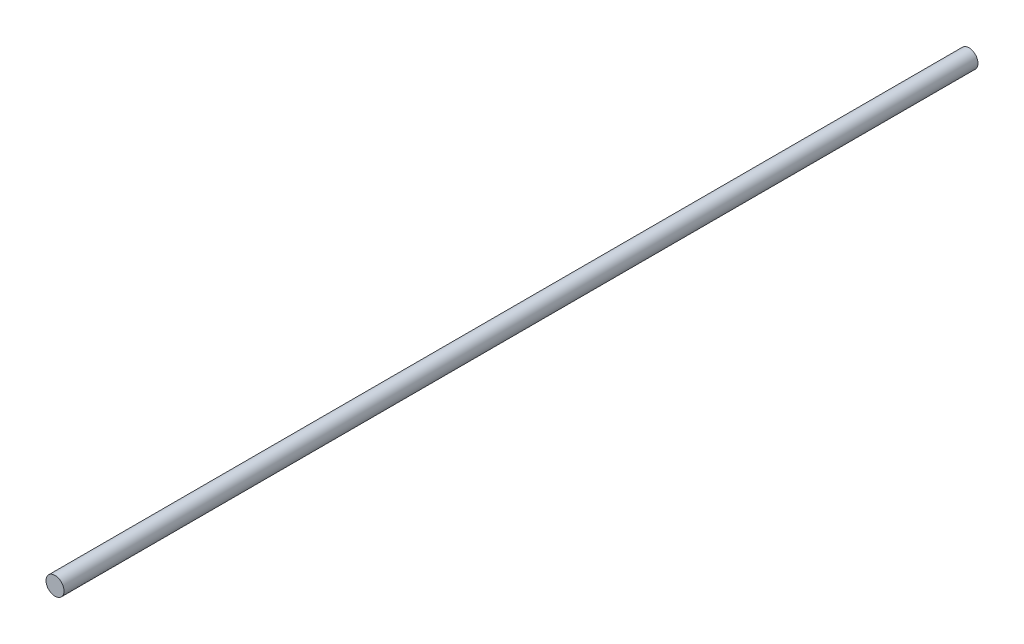
ISO-10303-21;
HEADER;
FILE_DESCRIPTION(('STEP AP214'),'2;1');
FILE_NAME('part.step','',(''),(''),'','','');
FILE_SCHEMA(('AUTOMOTIVE_DESIGN { 1 0 10303 214 1 1 1 1 }'));
ENDSEC;
DATA;
#1=APPLICATION_CONTEXT('core data for automotive mechanical design processes');
#2=APPLICATION_PROTOCOL_DEFINITION('international standard','automotive_design',2000,#1);
#3=PRODUCT_CONTEXT('',#1,'mechanical');
#4=PRODUCT('Part','Part','',(#3));
#5=PRODUCT_RELATED_PRODUCT_CATEGORY('part','',(#4));
#6=PRODUCT_DEFINITION_FORMATION('','',#4);
#7=PRODUCT_DEFINITION_CONTEXT('part definition',#1,'design');
#8=PRODUCT_DEFINITION('design','',#6,#7);
#9=PRODUCT_DEFINITION_SHAPE('','',#8);
#10=(LENGTH_UNIT() NAMED_UNIT(*) SI_UNIT(.MILLI.,.METRE.));
#11=(NAMED_UNIT(*) PLANE_ANGLE_UNIT() SI_UNIT($,.RADIAN.));
#12=(NAMED_UNIT(*) SI_UNIT($,.STERADIAN.) SOLID_ANGLE_UNIT());
#13=UNCERTAINTY_MEASURE_WITH_UNIT(LENGTH_MEASURE(1.E-05),#10,'distance_accuracy_value','');
#14=(GEOMETRIC_REPRESENTATION_CONTEXT(3) GLOBAL_UNCERTAINTY_ASSIGNED_CONTEXT((#13)) GLOBAL_UNIT_ASSIGNED_CONTEXT((#10,
#11,#12)) REPRESENTATION_CONTEXT('',''));
#15=CARTESIAN_POINT('',(0.,0.,0.));
#16=DIRECTION('',(0.,0.,1.));
#17=DIRECTION('',(1.,0.,0.));
#18=AXIS2_PLACEMENT_3D('',#15,#16,#17);
#19=CARTESIAN_POINT('',(0.,0.,405.));
#20=DIRECTION('',(0.,0.,-1.));
#21=DIRECTION('',(-1.,0.,0.));
#22=AXIS2_PLACEMENT_3D('',#19,#20,#21);
#23=CYLINDRICAL_SURFACE('',#22,4.);
#24=CARTESIAN_POINT('',(0.,0.,405.));
#25=DIRECTION('',(0.,0.,1.));
#26=DIRECTION('',(1.,0.,0.));
#27=AXIS2_PLACEMENT_3D('',#24,#25,#26);
#28=CIRCLE('',#27,4.);
#29=CARTESIAN_POINT('',(4.,0.,405.));
#30=VERTEX_POINT('',#29);
#31=EDGE_CURVE('E10',#30,#30,#28,.T.);
#32=ORIENTED_EDGE('',*,*,#31,.F.);
#33=EDGE_LOOP('',(#32));
#34=FACE_BOUND('',#33,.T.);
#35=CARTESIAN_POINT('',(0.,0.,0.));
#36=DIRECTION('',(0.,0.,1.));
#37=DIRECTION('',(1.,0.,0.));
#38=AXIS2_PLACEMENT_3D('',#35,#36,#37);
#39=CIRCLE('',#38,4.);
#40=CARTESIAN_POINT('',(4.,0.,0.));
#41=VERTEX_POINT('',#40);
#42=EDGE_CURVE('E36',#41,#41,#39,.T.);
#43=ORIENTED_EDGE('',*,*,#42,.T.);
#44=EDGE_LOOP('',(#43));
#45=FACE_BOUND('',#44,.T.);
#46=ADVANCED_FACE('F33',(#34,#45),#23,.T.);
#47=CARTESIAN_POINT('',(0.,0.,405.));
#48=DIRECTION('',(0.,0.,1.));
#49=DIRECTION('',(1.,0.,0.));
#50=AXIS2_PLACEMENT_3D('',#47,#48,#49);
#51=PLANE('',#50);
#52=ORIENTED_EDGE('',*,*,#31,.T.);
#53=EDGE_LOOP('',(#52));
#54=FACE_BOUND('',#53,.T.);
#55=ADVANCED_FACE('F48',(#54),#51,.T.);
#56=CARTESIAN_POINT('',(0.,0.,0.));
#57=DIRECTION('',(0.,0.,1.));
#58=DIRECTION('',(1.,0.,0.));
#59=AXIS2_PLACEMENT_3D('',#56,#57,#58);
#60=PLANE('',#59);
#61=ORIENTED_EDGE('',*,*,#42,.F.);
#62=EDGE_LOOP('',(#61));
#63=FACE_BOUND('',#62,.T.);
#64=ADVANCED_FACE('F46',(#63),#60,.F.);
#65=CLOSED_SHELL('',(#46,#55,#64));
#66=MANIFOLD_SOLID_BREP('B2',#65);
#67=ADVANCED_BREP_SHAPE_REPRESENTATION('',(#18,#66),#14);
#68=SHAPE_DEFINITION_REPRESENTATION(#9,#67);
ENDSEC;
END-ISO-10303-21;
